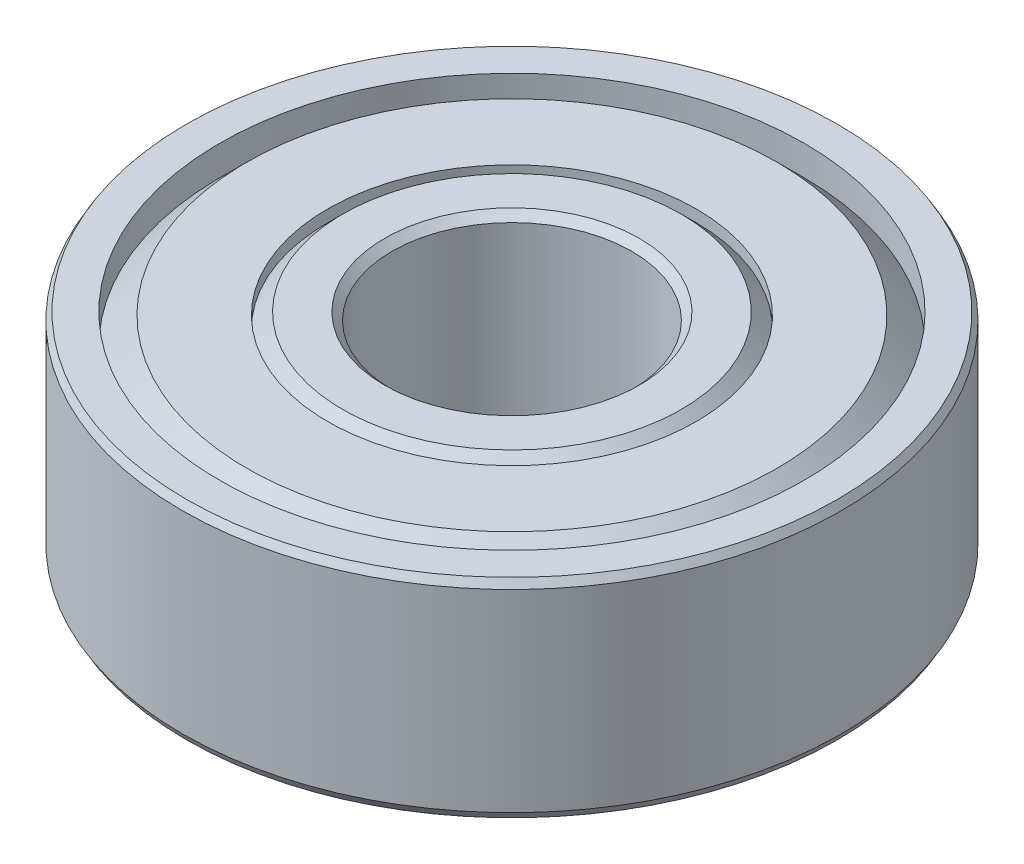
ISO-10303-21;
HEADER;
FILE_DESCRIPTION(('STEP AP214'),'2;1');
FILE_NAME('part.step','',(''),(''),'','','');
FILE_SCHEMA(('AUTOMOTIVE_DESIGN { 1 0 10303 214 1 1 1 1 }'));
ENDSEC;
DATA;
#1=APPLICATION_CONTEXT('core data for automotive mechanical design processes');
#2=APPLICATION_PROTOCOL_DEFINITION('international standard','automotive_design',2000,#1);
#3=PRODUCT_CONTEXT('',#1,'mechanical');
#4=PRODUCT('Part','Part','',(#3));
#5=PRODUCT_RELATED_PRODUCT_CATEGORY('part','',(#4));
#6=PRODUCT_DEFINITION_FORMATION('','',#4);
#7=PRODUCT_DEFINITION_CONTEXT('part definition',#1,'design');
#8=PRODUCT_DEFINITION('design','',#6,#7);
#9=PRODUCT_DEFINITION_SHAPE('','',#8);
#10=(LENGTH_UNIT() NAMED_UNIT(*) SI_UNIT(.MILLI.,.METRE.));
#11=(NAMED_UNIT(*) PLANE_ANGLE_UNIT() SI_UNIT($,.RADIAN.));
#12=(NAMED_UNIT(*) SI_UNIT($,.STERADIAN.) SOLID_ANGLE_UNIT());
#13=UNCERTAINTY_MEASURE_WITH_UNIT(LENGTH_MEASURE(1.E-05),#10,'distance_accuracy_value','');
#14=(GEOMETRIC_REPRESENTATION_CONTEXT(3) GLOBAL_UNCERTAINTY_ASSIGNED_CONTEXT((#13)) GLOBAL_UNIT_ASSIGNED_CONTEXT((#10,
#11,#12)) REPRESENTATION_CONTEXT('',''));
#15=CARTESIAN_POINT('',(0.,0.,0.));
#16=DIRECTION('',(0.,0.,1.));
#17=DIRECTION('',(1.,0.,0.));
#18=AXIS2_PLACEMENT_3D('',#15,#16,#17);
#19=CARTESIAN_POINT('',(0.,0.,0.));
#20=DIRECTION('',(0.,1.,0.));
#21=DIRECTION('',(0.,0.,1.));
#22=AXIS2_PLACEMENT_3D('',#19,#20,#21);
#23=PLANE('',#22);
#24=CARTESIAN_POINT('',(0.,0.,0.));
#25=DIRECTION('',(0.,1.,0.));
#26=DIRECTION('',(0.,0.,1.));
#27=AXIS2_PLACEMENT_3D('',#24,#25,#26);
#28=CIRCLE('',#27,10.8556624327026);
#29=CARTESIAN_POINT('',(0.,0.,10.8556624327026));
#30=VERTEX_POINT('',#29);
#31=EDGE_CURVE('E37',#30,#30,#28,.F.);
#32=ORIENTED_EDGE('',*,*,#31,.T.);
#33=EDGE_LOOP('',(#32));
#34=FACE_BOUND('',#33,.T.);
#35=CARTESIAN_POINT('',(0.,0.,0.));
#36=DIRECTION('',(0.,-1.,0.));
#37=DIRECTION('',(0.,0.,-1.));
#38=AXIS2_PLACEMENT_3D('',#35,#36,#37);
#39=CIRCLE('',#38,9.75);
#40=CARTESIAN_POINT('',(0.,0.,-9.75));
#41=VERTEX_POINT('',#40);
#42=EDGE_CURVE('E83',#41,#41,#39,.T.);
#43=ORIENTED_EDGE('',*,*,#42,.F.);
#44=EDGE_LOOP('',(#43));
#45=FACE_BOUND('',#44,.T.);
#46=ADVANCED_FACE('F30',(#34,#45),#23,.F.);
#47=CARTESIAN_POINT('',(0.,0.,0.));
#48=DIRECTION('',(0.,1.,0.));
#49=DIRECTION('',(0.,0.,1.));
#50=AXIS2_PLACEMENT_3D('',#47,#48,#49);
#51=CIRCLE('',#50,4.25);
#52=CARTESIAN_POINT('',(0.,0.,4.25));
#53=VERTEX_POINT('',#52);
#54=EDGE_CURVE('E59',#53,#53,#51,.T.);
#55=ORIENTED_EDGE('',*,*,#54,.T.);
#56=EDGE_LOOP('',(#55));
#57=FACE_BOUND('',#56,.T.);
#58=CARTESIAN_POINT('',(0.,0.,0.));
#59=DIRECTION('',(0.,-1.,0.));
#60=DIRECTION('',(0.,0.,-1.));
#61=AXIS2_PLACEMENT_3D('',#58,#59,#60);
#62=CIRCLE('',#61,5.65);
#63=CARTESIAN_POINT('',(0.,0.,-5.65));
#64=VERTEX_POINT('',#63);
#65=EDGE_CURVE('E86',#64,#64,#62,.T.);
#66=ORIENTED_EDGE('',*,*,#65,.T.);
#67=EDGE_LOOP('',(#66));
#68=FACE_BOUND('',#67,.T.);
#69=ADVANCED_FACE('F119',(#57,#68),#23,.F.);
#70=CARTESIAN_POINT('',(0.,6.95,0.));
#71=DIRECTION('',(0.,1.,0.));
#72=DIRECTION('',(0.,0.,1.));
#73=AXIS2_PLACEMENT_3D('',#70,#71,#72);
#74=PLANE('',#73);
#75=CARTESIAN_POINT('',(0.,6.95,0.));
#76=DIRECTION('',(0.,1.,0.));
#77=DIRECTION('',(0.,0.,1.));
#78=AXIS2_PLACEMENT_3D('',#75,#76,#77);
#79=CIRCLE('',#78,10.8556624327026);
#80=CARTESIAN_POINT('',(0.,6.95,10.8556624327026));
#81=VERTEX_POINT('',#80);
#82=EDGE_CURVE('E10',#81,#81,#79,.T.);
#83=ORIENTED_EDGE('',*,*,#82,.T.);
#84=EDGE_LOOP('',(#83));
#85=FACE_BOUND('',#84,.T.);
#86=CARTESIAN_POINT('',(0.,6.95,0.));
#87=DIRECTION('',(0.,-1.,0.));
#88=DIRECTION('',(0.,0.,-1.));
#89=AXIS2_PLACEMENT_3D('',#86,#87,#88);
#90=CIRCLE('',#89,9.75);
#91=CARTESIAN_POINT('',(0.,6.95,-9.75));
#92=VERTEX_POINT('',#91);
#93=EDGE_CURVE('E62',#92,#92,#90,.T.);
#94=ORIENTED_EDGE('',*,*,#93,.T.);
#95=EDGE_LOOP('',(#94));
#96=FACE_BOUND('',#95,.T.);
#97=ADVANCED_FACE('F124',(#85,#96),#74,.T.);
#98=CARTESIAN_POINT('',(0.,6.95,0.));
#99=DIRECTION('',(0.,1.,0.));
#100=DIRECTION('',(0.,0.,1.));
#101=AXIS2_PLACEMENT_3D('',#98,#99,#100);
#102=CIRCLE('',#101,4.25);
#103=CARTESIAN_POINT('',(0.,6.95,4.25));
#104=VERTEX_POINT('',#103);
#105=EDGE_CURVE('E50',#104,#104,#102,.F.);
#106=ORIENTED_EDGE('',*,*,#105,.T.);
#107=EDGE_LOOP('',(#106));
#108=FACE_BOUND('',#107,.T.);
#109=CARTESIAN_POINT('',(0.,6.95,0.));
#110=DIRECTION('',(0.,-1.,0.));
#111=DIRECTION('',(0.,0.,-1.));
#112=AXIS2_PLACEMENT_3D('',#109,#110,#111);
#113=CIRCLE('',#112,5.65);
#114=CARTESIAN_POINT('',(0.,6.95,-5.65));
#115=VERTEX_POINT('',#114);
#116=EDGE_CURVE('E77',#115,#115,#113,.T.);
#117=ORIENTED_EDGE('',*,*,#116,.F.);
#118=EDGE_LOOP('',(#117));
#119=FACE_BOUND('',#118,.T.);
#120=ADVANCED_FACE('F134',(#108,#119),#74,.T.);
#121=CARTESIAN_POINT('',(0.,6.95,0.));
#122=DIRECTION('',(0.,-1.,0.));
#123=DIRECTION('',(0.,0.,-1.));
#124=AXIS2_PLACEMENT_3D('',#121,#122,#123);
#125=CYLINDRICAL_SURFACE('',#124,11.);
#126=CARTESIAN_POINT('',(0.,0.25,0.));
#127=DIRECTION('',(0.,1.,0.));
#128=DIRECTION('',(0.,0.,1.));
#129=AXIS2_PLACEMENT_3D('',#126,#127,#128);
#130=CIRCLE('',#129,11.);
#131=CARTESIAN_POINT('',(0.,0.25,11.));
#132=VERTEX_POINT('',#131);
#133=EDGE_CURVE('E41',#132,#132,#130,.T.);
#134=ORIENTED_EDGE('',*,*,#133,.T.);
#135=EDGE_LOOP('',(#134));
#136=FACE_BOUND('',#135,.T.);
#137=CARTESIAN_POINT('',(0.,6.7,0.));
#138=DIRECTION('',(0.,1.,0.));
#139=DIRECTION('',(0.,0.,1.));
#140=AXIS2_PLACEMENT_3D('',#137,#138,#139);
#141=CIRCLE('',#140,11.);
#142=CARTESIAN_POINT('',(0.,6.7,11.));
#143=VERTEX_POINT('',#142);
#144=EDGE_CURVE('E45',#143,#143,#141,.F.);
#145=ORIENTED_EDGE('',*,*,#144,.T.);
#146=EDGE_LOOP('',(#145));
#147=FACE_BOUND('',#146,.T.);
#148=ADVANCED_FACE('F130',(#136,#147),#125,.T.);
#149=CARTESIAN_POINT('',(0.,6.95,0.));
#150=DIRECTION('',(0.,-1.,0.));
#151=DIRECTION('',(0.,0.,-1.));
#152=AXIS2_PLACEMENT_3D('',#149,#150,#151);
#153=CYLINDRICAL_SURFACE('',#152,4.);
#154=CARTESIAN_POINT('',(0.,0.25,0.));
#155=DIRECTION('',(0.,1.,0.));
#156=DIRECTION('',(0.,0.,1.));
#157=AXIS2_PLACEMENT_3D('',#154,#155,#156);
#158=CIRCLE('',#157,4.);
#159=CARTESIAN_POINT('',(0.,0.25,4.));
#160=VERTEX_POINT('',#159);
#161=EDGE_CURVE('E53',#160,#160,#158,.F.);
#162=ORIENTED_EDGE('',*,*,#161,.T.);
#163=EDGE_LOOP('',(#162));
#164=FACE_BOUND('',#163,.T.);
#165=CARTESIAN_POINT('',(0.,6.7,0.));
#166=DIRECTION('',(0.,1.,0.));
#167=DIRECTION('',(0.,0.,1.));
#168=AXIS2_PLACEMENT_3D('',#165,#166,#167);
#169=CIRCLE('',#168,4.);
#170=CARTESIAN_POINT('',(0.,6.7,4.));
#171=VERTEX_POINT('',#170);
#172=EDGE_CURVE('E56',#171,#171,#169,.T.);
#173=ORIENTED_EDGE('',*,*,#172,.T.);
#174=EDGE_LOOP('',(#173));
#175=FACE_BOUND('',#174,.T.);
#176=ADVANCED_FACE('F133',(#164,#175),#153,.F.);
#177=CARTESIAN_POINT('',(0.,0.,0.));
#178=DIRECTION('',(0.,-1.,0.));
#179=DIRECTION('',(0.,0.,-1.));
#180=AXIS2_PLACEMENT_3D('',#177,#178,#179);
#181=CYLINDRICAL_SURFACE('',#180,9.75);
#182=CARTESIAN_POINT('',(0.,5.95,0.));
#183=DIRECTION('',(0.,-1.,0.));
#184=DIRECTION('',(0.,0.,-1.));
#185=AXIS2_PLACEMENT_3D('',#182,#183,#184);
#186=CIRCLE('',#185,9.75);
#187=CARTESIAN_POINT('',(0.,5.95,-9.75));
#188=VERTEX_POINT('',#187);
#189=EDGE_CURVE('E65',#188,#188,#186,.T.);
#190=ORIENTED_EDGE('',*,*,#189,.T.);
#191=EDGE_LOOP('',(#190));
#192=FACE_BOUND('',#191,.T.);
#193=ORIENTED_EDGE('',*,*,#93,.F.);
#194=EDGE_LOOP('',(#193));
#195=FACE_BOUND('',#194,.T.);
#196=ADVANCED_FACE('F205',(#192,#195),#181,.F.);
#197=CARTESIAN_POINT('',(0.,5.95,0.));
#198=DIRECTION('',(0.,-1.,0.));
#199=DIRECTION('',(0.,0.,-1.));
#200=AXIS2_PLACEMENT_3D('',#197,#198,#199);
#201=CONICAL_SURFACE('',#200,9.75,0.785398163397443);
#202=CARTESIAN_POINT('',(0.,6.85,0.));
#203=DIRECTION('',(0.,-1.,0.));
#204=DIRECTION('',(0.,0.,-1.));
#205=AXIS2_PLACEMENT_3D('',#202,#203,#204);
#206=CIRCLE('',#205,8.85000000000001);
#207=CARTESIAN_POINT('',(0.,6.85,-8.85000000000001));
#208=VERTEX_POINT('',#207);
#209=EDGE_CURVE('E68',#208,#208,#206,.T.);
#210=ORIENTED_EDGE('',*,*,#209,.T.);
#211=EDGE_LOOP('',(#210));
#212=FACE_BOUND('',#211,.T.);
#213=ORIENTED_EDGE('',*,*,#189,.F.);
#214=EDGE_LOOP('',(#213));
#215=FACE_BOUND('',#214,.T.);
#216=ADVANCED_FACE('F277',(#212,#215),#201,.T.);
#217=CARTESIAN_POINT('',(-8.85000000000001,6.85,0.));
#218=DIRECTION('',(0.,1.,0.));
#219=DIRECTION('',(0.,0.,1.));
#220=AXIS2_PLACEMENT_3D('',#217,#218,#219);
#221=PLANE('',#220);
#222=CARTESIAN_POINT('',(0.,6.85,0.));
#223=DIRECTION('',(0.,-1.,0.));
#224=DIRECTION('',(0.,0.,-1.));
#225=AXIS2_PLACEMENT_3D('',#222,#223,#224);
#226=CIRCLE('',#225,6.15);
#227=CARTESIAN_POINT('',(0.,6.85,-6.15));
#228=VERTEX_POINT('',#227);
#229=EDGE_CURVE('E71',#228,#228,#226,.T.);
#230=ORIENTED_EDGE('',*,*,#229,.T.);
#231=EDGE_LOOP('',(#230));
#232=FACE_BOUND('',#231,.T.);
#233=ORIENTED_EDGE('',*,*,#209,.F.);
#234=EDGE_LOOP('',(#233));
#235=FACE_BOUND('',#234,.T.);
#236=ADVANCED_FACE('F267',(#232,#235),#221,.T.);
#237=CARTESIAN_POINT('',(0.,0.,0.));
#238=DIRECTION('',(0.,-1.,0.));
#239=DIRECTION('',(0.,0.,-1.));
#240=AXIS2_PLACEMENT_3D('',#237,#238,#239);
#241=CYLINDRICAL_SURFACE('',#240,6.15);
#242=CARTESIAN_POINT('',(0.,6.45,0.));
#243=DIRECTION('',(0.,-1.,0.));
#244=DIRECTION('',(0.,0.,-1.));
#245=AXIS2_PLACEMENT_3D('',#242,#243,#244);
#246=CIRCLE('',#245,6.15);
#247=CARTESIAN_POINT('',(0.,6.45,-6.15));
#248=VERTEX_POINT('',#247);
#249=EDGE_CURVE('E74',#248,#248,#246,.T.);
#250=ORIENTED_EDGE('',*,*,#249,.T.);
#251=EDGE_LOOP('',(#250));
#252=FACE_BOUND('',#251,.T.);
#253=ORIENTED_EDGE('',*,*,#229,.F.);
#254=EDGE_LOOP('',(#253));
#255=FACE_BOUND('',#254,.T.);
#256=ADVANCED_FACE('F115',(#252,#255),#241,.F.);
#257=CARTESIAN_POINT('',(0.,6.45,0.));
#258=DIRECTION('',(0.,-1.,0.));
#259=DIRECTION('',(0.,0.,-1.));
#260=AXIS2_PLACEMENT_3D('',#257,#258,#259);
#261=CONICAL_SURFACE('',#260,6.15,0.785398163397453);
#262=ORIENTED_EDGE('',*,*,#116,.T.);
#263=EDGE_LOOP('',(#262));
#264=FACE_BOUND('',#263,.T.);
#265=ORIENTED_EDGE('',*,*,#249,.F.);
#266=EDGE_LOOP('',(#265));
#267=FACE_BOUND('',#266,.T.);
#268=ADVANCED_FACE('F105',(#264,#267),#261,.T.);
#269=CARTESIAN_POINT('',(0.,0.0999999999999985,0.));
#270=DIRECTION('',(0.,1.,0.));
#271=DIRECTION('',(0.,0.,1.));
#272=AXIS2_PLACEMENT_3D('',#269,#270,#271);
#273=CONICAL_SURFACE('',#272,8.85000000000001,0.785398163397443);
#274=CARTESIAN_POINT('',(0.,0.999999999999997,0.));
#275=DIRECTION('',(0.,-1.,0.));
#276=DIRECTION('',(0.,0.,-1.));
#277=AXIS2_PLACEMENT_3D('',#274,#275,#276);
#278=CIRCLE('',#277,9.75);
#279=CARTESIAN_POINT('',(0.,0.999999999999997,-9.75));
#280=VERTEX_POINT('',#279);
#281=EDGE_CURVE('E80',#280,#280,#278,.T.);
#282=ORIENTED_EDGE('',*,*,#281,.T.);
#283=EDGE_LOOP('',(#282));
#284=FACE_BOUND('',#283,.T.);
#285=CARTESIAN_POINT('',(0.,0.0999999999999985,0.));
#286=DIRECTION('',(0.,-1.,0.));
#287=DIRECTION('',(0.,0.,-1.));
#288=AXIS2_PLACEMENT_3D('',#285,#286,#287);
#289=CIRCLE('',#288,8.85000000000001);
#290=CARTESIAN_POINT('',(0.,0.0999999999999985,-8.85000000000001));
#291=VERTEX_POINT('',#290);
#292=EDGE_CURVE('E95',#291,#291,#289,.T.);
#293=ORIENTED_EDGE('',*,*,#292,.F.);
#294=EDGE_LOOP('',(#293));
#295=FACE_BOUND('',#294,.T.);
#296=ADVANCED_FACE('F102',(#284,#295),#273,.T.);
#297=CARTESIAN_POINT('',(0.,0.,0.));
#298=DIRECTION('',(0.,-1.,0.));
#299=DIRECTION('',(0.,0.,-1.));
#300=AXIS2_PLACEMENT_3D('',#297,#298,#299);
#301=CYLINDRICAL_SURFACE('',#300,9.75);
#302=ORIENTED_EDGE('',*,*,#42,.T.);
#303=EDGE_LOOP('',(#302));
#304=FACE_BOUND('',#303,.T.);
#305=ORIENTED_EDGE('',*,*,#281,.F.);
#306=EDGE_LOOP('',(#305));
#307=FACE_BOUND('',#306,.T.);
#308=ADVANCED_FACE('F104',(#304,#307),#301,.F.);
#309=CARTESIAN_POINT('',(0.,0.,0.));
#310=DIRECTION('',(0.,1.,0.));
#311=DIRECTION('',(0.,0.,1.));
#312=AXIS2_PLACEMENT_3D('',#309,#310,#311);
#313=CONICAL_SURFACE('',#312,5.65,0.785398163397453);
#314=CARTESIAN_POINT('',(0.,0.499999999999998,0.));
#315=DIRECTION('',(0.,-1.,0.));
#316=DIRECTION('',(0.,0.,-1.));
#317=AXIS2_PLACEMENT_3D('',#314,#315,#316);
#318=CIRCLE('',#317,6.15);
#319=CARTESIAN_POINT('',(0.,0.499999999999998,-6.15));
#320=VERTEX_POINT('',#319);
#321=EDGE_CURVE('E89',#320,#320,#318,.T.);
#322=ORIENTED_EDGE('',*,*,#321,.T.);
#323=EDGE_LOOP('',(#322));
#324=FACE_BOUND('',#323,.T.);
#325=ORIENTED_EDGE('',*,*,#65,.F.);
#326=EDGE_LOOP('',(#325));
#327=FACE_BOUND('',#326,.T.);
#328=ADVANCED_FACE('F112',(#324,#327),#313,.T.);
#329=CARTESIAN_POINT('',(0.,0.,0.));
#330=DIRECTION('',(0.,-1.,0.));
#331=DIRECTION('',(0.,0.,-1.));
#332=AXIS2_PLACEMENT_3D('',#329,#330,#331);
#333=CYLINDRICAL_SURFACE('',#332,6.15);
#334=CARTESIAN_POINT('',(0.,0.0999999999999985,0.));
#335=DIRECTION('',(0.,-1.,0.));
#336=DIRECTION('',(0.,0.,-1.));
#337=AXIS2_PLACEMENT_3D('',#334,#335,#336);
#338=CIRCLE('',#337,6.15);
#339=CARTESIAN_POINT('',(0.,0.0999999999999985,-6.15));
#340=VERTEX_POINT('',#339);
#341=EDGE_CURVE('E92',#340,#340,#338,.T.);
#342=ORIENTED_EDGE('',*,*,#341,.T.);
#343=EDGE_LOOP('',(#342));
#344=FACE_BOUND('',#343,.T.);
#345=ORIENTED_EDGE('',*,*,#321,.F.);
#346=EDGE_LOOP('',(#345));
#347=FACE_BOUND('',#346,.T.);
#348=ADVANCED_FACE('F224',(#344,#347),#333,.F.);
#349=CARTESIAN_POINT('',(-8.85000000000001,0.0999999999999985,0.));
#350=DIRECTION('',(0.,-1.,0.));
#351=DIRECTION('',(0.,0.,-1.));
#352=AXIS2_PLACEMENT_3D('',#349,#350,#351);
#353=PLANE('',#352);
#354=ORIENTED_EDGE('',*,*,#292,.T.);
#355=EDGE_LOOP('',(#354));
#356=FACE_BOUND('',#355,.T.);
#357=ORIENTED_EDGE('',*,*,#341,.F.);
#358=EDGE_LOOP('',(#357));
#359=FACE_BOUND('',#358,.T.);
#360=ADVANCED_FACE('F99',(#356,#359),#353,.T.);
#361=CARTESIAN_POINT('',(0.,0.,0.));
#362=DIRECTION('',(0.,-1.,0.));
#363=DIRECTION('',(0.,0.,-1.));
#364=AXIS2_PLACEMENT_3D('',#361,#362,#363);
#365=CONICAL_SURFACE('',#364,4.25,0.785398163397455);
#366=ORIENTED_EDGE('',*,*,#161,.F.);
#367=EDGE_LOOP('',(#366));
#368=FACE_BOUND('',#367,.T.);
#369=ORIENTED_EDGE('',*,*,#54,.F.);
#370=EDGE_LOOP('',(#369));
#371=FACE_BOUND('',#370,.T.);
#372=ADVANCED_FACE('F136',(#368,#371),#365,.F.);
#373=CARTESIAN_POINT('',(0.,6.7,0.));
#374=DIRECTION('',(0.,1.,0.));
#375=DIRECTION('',(0.,0.,1.));
#376=AXIS2_PLACEMENT_3D('',#373,#374,#375);
#377=CONICAL_SURFACE('',#376,4.,0.785398163397448);
#378=ORIENTED_EDGE('',*,*,#105,.F.);
#379=EDGE_LOOP('',(#378));
#380=FACE_BOUND('',#379,.T.);
#381=ORIENTED_EDGE('',*,*,#172,.F.);
#382=EDGE_LOOP('',(#381));
#383=FACE_BOUND('',#382,.T.);
#384=ADVANCED_FACE('F139',(#380,#383),#377,.F.);
#385=CARTESIAN_POINT('',(0.,0.25,0.));
#386=DIRECTION('',(0.,1.,0.));
#387=DIRECTION('',(0.,0.,1.));
#388=AXIS2_PLACEMENT_3D('',#385,#386,#387);
#389=CONICAL_SURFACE('',#388,11.,0.523598775598304);
#390=ORIENTED_EDGE('',*,*,#31,.F.);
#391=EDGE_LOOP('',(#390));
#392=FACE_BOUND('',#391,.T.);
#393=ORIENTED_EDGE('',*,*,#133,.F.);
#394=EDGE_LOOP('',(#393));
#395=FACE_BOUND('',#394,.T.);
#396=ADVANCED_FACE('F142',(#392,#395),#389,.T.);
#397=CARTESIAN_POINT('',(0.,6.95,0.));
#398=DIRECTION('',(0.,-1.,0.));
#399=DIRECTION('',(0.,0.,-1.));
#400=AXIS2_PLACEMENT_3D('',#397,#398,#399);
#401=CONICAL_SURFACE('',#400,10.8556624327026,0.523598775598304);
#402=ORIENTED_EDGE('',*,*,#144,.F.);
#403=EDGE_LOOP('',(#402));
#404=FACE_BOUND('',#403,.T.);
#405=ORIENTED_EDGE('',*,*,#82,.F.);
#406=EDGE_LOOP('',(#405));
#407=FACE_BOUND('',#406,.T.);
#408=ADVANCED_FACE('F32',(#404,#407),#401,.T.);
#409=CLOSED_SHELL('',(#46,#69,#97,#120,#148,#176,#196,#216,#236,#256,#268,#296,#308,#328,#348,
#360,#372,#384,#396,#408));
#410=MANIFOLD_SOLID_BREP('B2',#409);
#411=ADVANCED_BREP_SHAPE_REPRESENTATION('',(#18,#410),#14);
#412=SHAPE_DEFINITION_REPRESENTATION(#9,#411);
ENDSEC;
END-ISO-10303-21;
